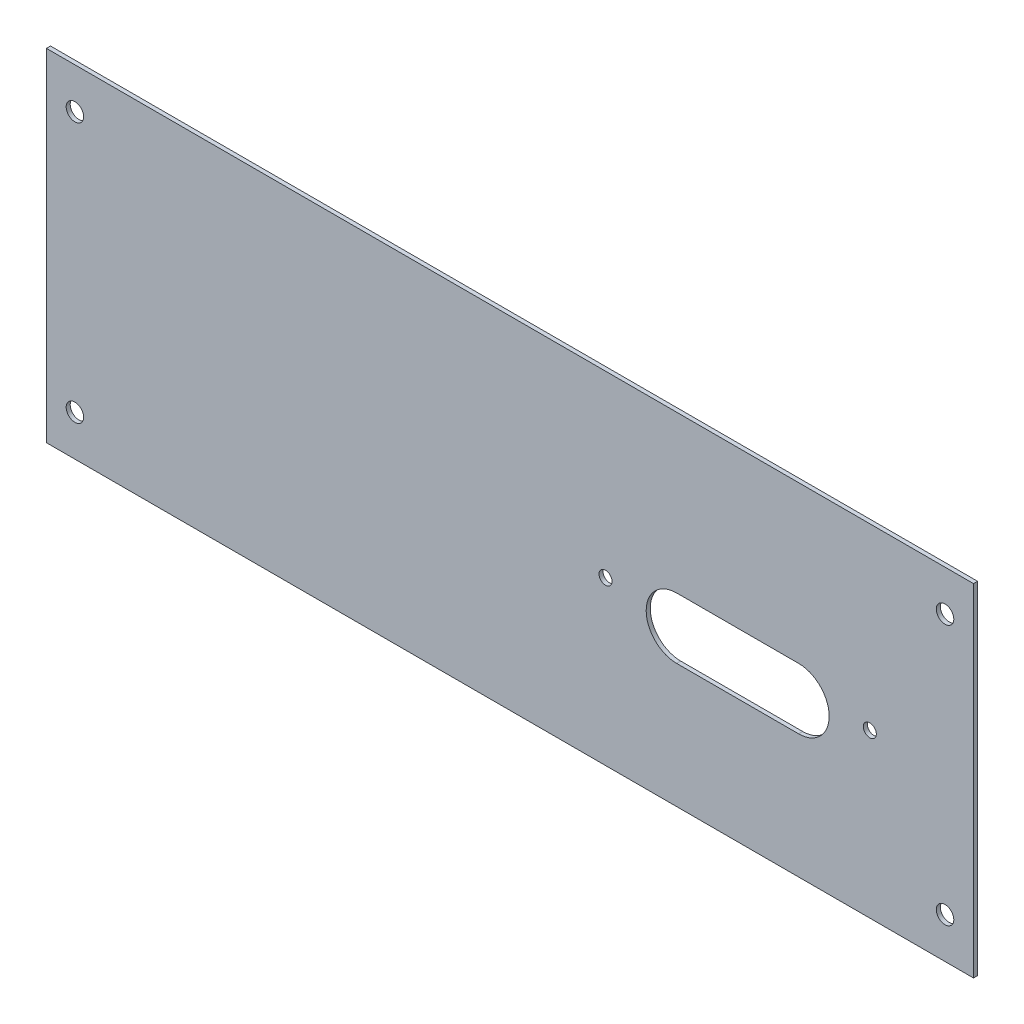
ISO-10303-21;
HEADER;
FILE_DESCRIPTION(('STEP AP214'),'2;1');
FILE_NAME('part.step','',(''),(''),'','','');
FILE_SCHEMA(('AUTOMOTIVE_DESIGN { 1 0 10303 214 1 1 1 1 }'));
ENDSEC;
DATA;
#1=APPLICATION_CONTEXT('core data for automotive mechanical design processes');
#2=APPLICATION_PROTOCOL_DEFINITION('international standard','automotive_design',2000,#1);
#3=PRODUCT_CONTEXT('',#1,'mechanical');
#4=PRODUCT('Part','Part','',(#3));
#5=PRODUCT_RELATED_PRODUCT_CATEGORY('part','',(#4));
#6=PRODUCT_DEFINITION_FORMATION('','',#4);
#7=PRODUCT_DEFINITION_CONTEXT('part definition',#1,'design');
#8=PRODUCT_DEFINITION('design','',#6,#7);
#9=PRODUCT_DEFINITION_SHAPE('','',#8);
#10=(LENGTH_UNIT() NAMED_UNIT(*) SI_UNIT(.MILLI.,.METRE.));
#11=(NAMED_UNIT(*) PLANE_ANGLE_UNIT() SI_UNIT($,.RADIAN.));
#12=(NAMED_UNIT(*) SI_UNIT($,.STERADIAN.) SOLID_ANGLE_UNIT());
#13=UNCERTAINTY_MEASURE_WITH_UNIT(LENGTH_MEASURE(1.E-05),#10,'distance_accuracy_value','');
#14=(GEOMETRIC_REPRESENTATION_CONTEXT(3) GLOBAL_UNCERTAINTY_ASSIGNED_CONTEXT((#13)) GLOBAL_UNIT_ASSIGNED_CONTEXT((#10,
#11,#12)) REPRESENTATION_CONTEXT('',''));
#15=CARTESIAN_POINT('',(0.,0.,0.));
#16=DIRECTION('',(0.,0.,1.));
#17=DIRECTION('',(1.,0.,0.));
#18=AXIS2_PLACEMENT_3D('',#15,#16,#17);
#19=CARTESIAN_POINT('',(-114.,-42.,1.));
#20=DIRECTION('',(0.,0.,-1.));
#21=DIRECTION('',(-1.,0.,0.));
#22=AXIS2_PLACEMENT_3D('',#19,#20,#21);
#23=PLANE('',#22);
#24=CARTESIAN_POINT('',(107.,-32.,1.));
#25=DIRECTION('',(0.,0.,1.));
#26=DIRECTION('',(-1.,0.,0.));
#27=AXIS2_PLACEMENT_3D('',#24,#25,#26);
#28=CIRCLE('',#27,2.15);
#29=CARTESIAN_POINT('',(104.85,-32.,1.));
#30=VERTEX_POINT('',#29);
#31=EDGE_CURVE('E237',#30,#30,#28,.T.);
#32=ORIENTED_EDGE('',*,*,#31,.F.);
#33=EDGE_LOOP('',(#32));
#34=FACE_BOUND('',#33,.T.);
#35=CARTESIAN_POINT('',(-107.,32.,1.));
#36=DIRECTION('',(0.,0.,1.));
#37=DIRECTION('',(-1.,0.,0.));
#38=AXIS2_PLACEMENT_3D('',#35,#36,#37);
#39=CIRCLE('',#38,2.15);
#40=CARTESIAN_POINT('',(-109.15,32.,1.));
#41=VERTEX_POINT('',#40);
#42=EDGE_CURVE('E247',#41,#41,#39,.T.);
#43=ORIENTED_EDGE('',*,*,#42,.F.);
#44=EDGE_LOOP('',(#43));
#45=FACE_BOUND('',#44,.T.);
#46=CARTESIAN_POINT('',(41.,-4.,1.));
#47=DIRECTION('',(0.,0.,1.));
#48=DIRECTION('',(1.,0.,0.));
#49=AXIS2_PLACEMENT_3D('',#46,#47,#48);
#50=CIRCLE('',#49,7.5);
#51=CARTESIAN_POINT('',(41.,3.5,1.));
#52=VERTEX_POINT('',#51);
#53=CARTESIAN_POINT('',(41.,-11.5,1.));
#54=VERTEX_POINT('',#53);
#55=EDGE_CURVE('E98',#52,#54,#50,.T.);
#56=ORIENTED_EDGE('',*,*,#55,.F.);
#57=DIRECTION('',(-1.,0.,0.));
#58=VECTOR('',#57,1.);
#59=CARTESIAN_POINT('',(41.,3.5,1.));
#60=LINE('',#59,#58);
#61=CARTESIAN_POINT('',(71.,3.50000000000002,1.));
#62=VERTEX_POINT('',#61);
#63=EDGE_CURVE('E121',#62,#52,#60,.T.);
#64=ORIENTED_EDGE('',*,*,#63,.F.);
#65=CARTESIAN_POINT('',(71.,-3.99999999999998,1.));
#66=DIRECTION('',(0.,0.,1.));
#67=DIRECTION('',(-1.,0.,0.));
#68=AXIS2_PLACEMENT_3D('',#65,#66,#67);
#69=CIRCLE('',#68,7.5);
#70=CARTESIAN_POINT('',(71.,-11.5,1.));
#71=VERTEX_POINT('',#70);
#72=EDGE_CURVE('E119',#71,#62,#69,.T.);
#73=ORIENTED_EDGE('',*,*,#72,.F.);
#74=DIRECTION('',(1.,0.,0.));
#75=VECTOR('',#74,1.);
#76=CARTESIAN_POINT('',(41.,-11.5,1.));
#77=LINE('',#76,#75);
#78=EDGE_CURVE('E106',#54,#71,#77,.T.);
#79=ORIENTED_EDGE('',*,*,#78,.F.);
#80=EDGE_LOOP('',(#56,#64,#73,#79));
#81=FACE_BOUND('',#80,.T.);
#82=DIRECTION('',(0.,-1.,0.));
#83=VECTOR('',#82,1.);
#84=CARTESIAN_POINT('',(-114.,-42.,1.));
#85=LINE('',#84,#83);
#86=CARTESIAN_POINT('',(-114.,42.,1.));
#87=VERTEX_POINT('',#86);
#88=CARTESIAN_POINT('',(-114.,-42.,1.));
#89=VERTEX_POINT('',#88);
#90=EDGE_CURVE('E143',#87,#89,#85,.T.);
#91=ORIENTED_EDGE('',*,*,#90,.T.);
#92=DIRECTION('',(1.,0.,0.));
#93=VECTOR('',#92,1.);
#94=CARTESIAN_POINT('',(-114.,-42.,1.));
#95=LINE('',#94,#93);
#96=CARTESIAN_POINT('',(114.,-42.,1.));
#97=VERTEX_POINT('',#96);
#98=EDGE_CURVE('E146',#89,#97,#95,.T.);
#99=ORIENTED_EDGE('',*,*,#98,.T.);
#100=DIRECTION('',(0.,1.,0.));
#101=VECTOR('',#100,1.);
#102=CARTESIAN_POINT('',(114.,-42.,1.));
#103=LINE('',#102,#101);
#104=CARTESIAN_POINT('',(114.,42.,1.));
#105=VERTEX_POINT('',#104);
#106=EDGE_CURVE('E149',#97,#105,#103,.T.);
#107=ORIENTED_EDGE('',*,*,#106,.T.);
#108=DIRECTION('',(-1.,0.,0.));
#109=VECTOR('',#108,1.);
#110=CARTESIAN_POINT('',(-114.,42.,1.));
#111=LINE('',#110,#109);
#112=EDGE_CURVE('E151',#105,#87,#111,.T.);
#113=ORIENTED_EDGE('',*,*,#112,.T.);
#114=EDGE_LOOP('',(#91,#99,#107,#113));
#115=FACE_BOUND('',#114,.T.);
#116=CARTESIAN_POINT('',(23.5,-1.99999999999999,1.));
#117=DIRECTION('',(0.,0.,1.));
#118=DIRECTION('',(1.,0.,0.));
#119=AXIS2_PLACEMENT_3D('',#116,#117,#118);
#120=CIRCLE('',#119,1.6);
#121=CARTESIAN_POINT('',(25.1,-1.99999999999999,1.));
#122=VERTEX_POINT('',#121);
#123=EDGE_CURVE('E137',#122,#122,#120,.T.);
#124=ORIENTED_EDGE('',*,*,#123,.F.);
#125=EDGE_LOOP('',(#124));
#126=FACE_BOUND('',#125,.T.);
#127=CARTESIAN_POINT('',(107.,32.,1.));
#128=DIRECTION('',(0.,0.,1.));
#129=DIRECTION('',(1.,0.,0.));
#130=AXIS2_PLACEMENT_3D('',#127,#128,#129);
#131=CIRCLE('',#130,2.15);
#132=CARTESIAN_POINT('',(109.15,32.,1.));
#133=VERTEX_POINT('',#132);
#134=EDGE_CURVE('E127',#133,#133,#131,.T.);
#135=ORIENTED_EDGE('',*,*,#134,.F.);
#136=EDGE_LOOP('',(#135));
#137=FACE_BOUND('',#136,.T.);
#138=CARTESIAN_POINT('',(-107.,-32.,1.));
#139=DIRECTION('',(0.,0.,1.));
#140=DIRECTION('',(1.,0.,0.));
#141=AXIS2_PLACEMENT_3D('',#138,#139,#140);
#142=CIRCLE('',#141,2.15);
#143=CARTESIAN_POINT('',(-104.85,-32.,1.));
#144=VERTEX_POINT('',#143);
#145=EDGE_CURVE('E242',#144,#144,#142,.T.);
#146=ORIENTED_EDGE('',*,*,#145,.F.);
#147=EDGE_LOOP('',(#146));
#148=FACE_BOUND('',#147,.T.);
#149=CARTESIAN_POINT('',(88.5,-1.99999999999999,1.));
#150=DIRECTION('',(0.,0.,1.));
#151=DIRECTION('',(1.,0.,0.));
#152=AXIS2_PLACEMENT_3D('',#149,#150,#151);
#153=CIRCLE('',#152,1.60000000000001);
#154=CARTESIAN_POINT('',(90.1,-1.99999999999999,1.));
#155=VERTEX_POINT('',#154);
#156=EDGE_CURVE('E231',#155,#155,#153,.T.);
#157=ORIENTED_EDGE('',*,*,#156,.F.);
#158=EDGE_LOOP('',(#157));
#159=FACE_BOUND('',#158,.T.);
#160=ADVANCED_FACE('F33',(#34,#45,#81,#115,#126,#137,#148,#159),#23,.F.);
#161=CARTESIAN_POINT('',(-114.,-42.,0.));
#162=DIRECTION('',(0.,0.,-1.));
#163=DIRECTION('',(-1.,0.,0.));
#164=AXIS2_PLACEMENT_3D('',#161,#162,#163);
#165=PLANE('',#164);
#166=CARTESIAN_POINT('',(107.,-32.,0.));
#167=DIRECTION('',(0.,0.,1.));
#168=DIRECTION('',(-1.,0.,0.));
#169=AXIS2_PLACEMENT_3D('',#166,#167,#168);
#170=CIRCLE('',#169,2.15);
#171=CARTESIAN_POINT('',(104.85,-32.,0.));
#172=VERTEX_POINT('',#171);
#173=EDGE_CURVE('E234',#172,#172,#170,.T.);
#174=ORIENTED_EDGE('',*,*,#173,.T.);
#175=EDGE_LOOP('',(#174));
#176=FACE_BOUND('',#175,.T.);
#177=CARTESIAN_POINT('',(-107.,32.,0.));
#178=DIRECTION('',(0.,0.,1.));
#179=DIRECTION('',(-1.,0.,0.));
#180=AXIS2_PLACEMENT_3D('',#177,#178,#179);
#181=CIRCLE('',#180,2.15);
#182=CARTESIAN_POINT('',(-109.15,32.,0.));
#183=VERTEX_POINT('',#182);
#184=EDGE_CURVE('E245',#183,#183,#181,.T.);
#185=ORIENTED_EDGE('',*,*,#184,.T.);
#186=EDGE_LOOP('',(#185));
#187=FACE_BOUND('',#186,.T.);
#188=DIRECTION('',(-1.,0.,0.));
#189=VECTOR('',#188,1.);
#190=CARTESIAN_POINT('',(41.,3.5,0.));
#191=LINE('',#190,#189);
#192=CARTESIAN_POINT('',(71.,3.50000000000002,0.));
#193=VERTEX_POINT('',#192);
#194=CARTESIAN_POINT('',(41.,3.5,0.));
#195=VERTEX_POINT('',#194);
#196=EDGE_CURVE('E107',#193,#195,#191,.T.);
#197=ORIENTED_EDGE('',*,*,#196,.T.);
#198=CARTESIAN_POINT('',(41.,-4.,0.));
#199=DIRECTION('',(0.,0.,1.));
#200=DIRECTION('',(1.,0.,0.));
#201=AXIS2_PLACEMENT_3D('',#198,#199,#200);
#202=CIRCLE('',#201,7.5);
#203=CARTESIAN_POINT('',(41.,-11.5,0.));
#204=VERTEX_POINT('',#203);
#205=EDGE_CURVE('E56',#195,#204,#202,.T.);
#206=ORIENTED_EDGE('',*,*,#205,.T.);
#207=DIRECTION('',(1.,0.,0.));
#208=VECTOR('',#207,1.);
#209=CARTESIAN_POINT('',(41.,-11.5,0.));
#210=LINE('',#209,#208);
#211=CARTESIAN_POINT('',(71.,-11.5,0.));
#212=VERTEX_POINT('',#211);
#213=EDGE_CURVE('E113',#204,#212,#210,.T.);
#214=ORIENTED_EDGE('',*,*,#213,.T.);
#215=CARTESIAN_POINT('',(71.,-3.99999999999998,0.));
#216=DIRECTION('',(0.,0.,1.));
#217=DIRECTION('',(-1.,0.,0.));
#218=AXIS2_PLACEMENT_3D('',#215,#216,#217);
#219=CIRCLE('',#218,7.5);
#220=EDGE_CURVE('E129',#212,#193,#219,.T.);
#221=ORIENTED_EDGE('',*,*,#220,.T.);
#222=EDGE_LOOP('',(#197,#206,#214,#221));
#223=FACE_BOUND('',#222,.T.);
#224=DIRECTION('',(0.,-1.,0.));
#225=VECTOR('',#224,1.);
#226=CARTESIAN_POINT('',(-114.,-42.,0.));
#227=LINE('',#226,#225);
#228=CARTESIAN_POINT('',(-114.,42.,0.));
#229=VERTEX_POINT('',#228);
#230=CARTESIAN_POINT('',(-114.,-42.,0.));
#231=VERTEX_POINT('',#230);
#232=EDGE_CURVE('E140',#229,#231,#227,.T.);
#233=ORIENTED_EDGE('',*,*,#232,.F.);
#234=DIRECTION('',(-1.,0.,0.));
#235=VECTOR('',#234,1.);
#236=CARTESIAN_POINT('',(-114.,42.,0.));
#237=LINE('',#236,#235);
#238=CARTESIAN_POINT('',(114.,42.,0.));
#239=VERTEX_POINT('',#238);
#240=EDGE_CURVE('E147',#239,#229,#237,.T.);
#241=ORIENTED_EDGE('',*,*,#240,.F.);
#242=DIRECTION('',(0.,1.,0.));
#243=VECTOR('',#242,1.);
#244=CARTESIAN_POINT('',(114.,-42.,0.));
#245=LINE('',#244,#243);
#246=CARTESIAN_POINT('',(114.,-42.,0.));
#247=VERTEX_POINT('',#246);
#248=EDGE_CURVE('E158',#247,#239,#245,.T.);
#249=ORIENTED_EDGE('',*,*,#248,.F.);
#250=DIRECTION('',(1.,0.,0.));
#251=VECTOR('',#250,1.);
#252=CARTESIAN_POINT('',(-114.,-42.,0.));
#253=LINE('',#252,#251);
#254=EDGE_CURVE('E156',#231,#247,#253,.T.);
#255=ORIENTED_EDGE('',*,*,#254,.F.);
#256=EDGE_LOOP('',(#233,#241,#249,#255));
#257=FACE_BOUND('',#256,.T.);
#258=CARTESIAN_POINT('',(23.5,-1.99999999999999,0.));
#259=DIRECTION('',(0.,0.,1.));
#260=DIRECTION('',(1.,0.,0.));
#261=AXIS2_PLACEMENT_3D('',#258,#259,#260);
#262=CIRCLE('',#261,1.6);
#263=CARTESIAN_POINT('',(25.1,-1.99999999999999,0.));
#264=VERTEX_POINT('',#263);
#265=EDGE_CURVE('E114',#264,#264,#262,.T.);
#266=ORIENTED_EDGE('',*,*,#265,.T.);
#267=EDGE_LOOP('',(#266));
#268=FACE_BOUND('',#267,.T.);
#269=CARTESIAN_POINT('',(107.,32.,0.));
#270=DIRECTION('',(0.,0.,1.));
#271=DIRECTION('',(1.,0.,0.));
#272=AXIS2_PLACEMENT_3D('',#269,#270,#271);
#273=CIRCLE('',#272,2.15);
#274=CARTESIAN_POINT('',(109.15,32.,0.));
#275=VERTEX_POINT('',#274);
#276=EDGE_CURVE('E222',#275,#275,#273,.T.);
#277=ORIENTED_EDGE('',*,*,#276,.T.);
#278=EDGE_LOOP('',(#277));
#279=FACE_BOUND('',#278,.T.);
#280=CARTESIAN_POINT('',(-107.,-32.,0.));
#281=DIRECTION('',(0.,0.,1.));
#282=DIRECTION('',(1.,0.,0.));
#283=AXIS2_PLACEMENT_3D('',#280,#281,#282);
#284=CIRCLE('',#283,2.15);
#285=CARTESIAN_POINT('',(-104.85,-32.,0.));
#286=VERTEX_POINT('',#285);
#287=EDGE_CURVE('E226',#286,#286,#284,.T.);
#288=ORIENTED_EDGE('',*,*,#287,.T.);
#289=EDGE_LOOP('',(#288));
#290=FACE_BOUND('',#289,.T.);
#291=CARTESIAN_POINT('',(88.5,-1.99999999999999,0.));
#292=DIRECTION('',(0.,0.,1.));
#293=DIRECTION('',(1.,0.,0.));
#294=AXIS2_PLACEMENT_3D('',#291,#292,#293);
#295=CIRCLE('',#294,1.60000000000001);
#296=CARTESIAN_POINT('',(90.1,-1.99999999999999,0.));
#297=VERTEX_POINT('',#296);
#298=EDGE_CURVE('E229',#297,#297,#295,.T.);
#299=ORIENTED_EDGE('',*,*,#298,.T.);
#300=EDGE_LOOP('',(#299));
#301=FACE_BOUND('',#300,.T.);
#302=ADVANCED_FACE('F176',(#176,#187,#223,#257,#268,#279,#290,#301),#165,.T.);
#303=CARTESIAN_POINT('',(-114.,-42.,1.));
#304=DIRECTION('',(1.,0.,0.));
#305=DIRECTION('',(0.,0.,-1.));
#306=AXIS2_PLACEMENT_3D('',#303,#304,#305);
#307=PLANE('',#306);
#308=ORIENTED_EDGE('',*,*,#232,.T.);
#309=DIRECTION('',(0.,0.,-1.));
#310=VECTOR('',#309,1.);
#311=CARTESIAN_POINT('',(-114.,-42.,1.));
#312=LINE('',#311,#310);
#313=EDGE_CURVE('E11',#89,#231,#312,.T.);
#314=ORIENTED_EDGE('',*,*,#313,.F.);
#315=ORIENTED_EDGE('',*,*,#90,.F.);
#316=DIRECTION('',(0.,0.,-1.));
#317=VECTOR('',#316,1.);
#318=CARTESIAN_POINT('',(-114.,42.,1.));
#319=LINE('',#318,#317);
#320=EDGE_CURVE('E153',#87,#229,#319,.T.);
#321=ORIENTED_EDGE('',*,*,#320,.T.);
#322=EDGE_LOOP('',(#308,#314,#315,#321));
#323=FACE_BOUND('',#322,.T.);
#324=ADVANCED_FACE('F35',(#323),#307,.F.);
#325=CARTESIAN_POINT('',(-114.,-42.,1.));
#326=DIRECTION('',(0.,1.,0.));
#327=DIRECTION('',(0.,0.,1.));
#328=AXIS2_PLACEMENT_3D('',#325,#326,#327);
#329=PLANE('',#328);
#330=ORIENTED_EDGE('',*,*,#254,.T.);
#331=DIRECTION('',(0.,0.,-1.));
#332=VECTOR('',#331,1.);
#333=CARTESIAN_POINT('',(114.,-42.,1.));
#334=LINE('',#333,#332);
#335=EDGE_CURVE('E41',#97,#247,#334,.T.);
#336=ORIENTED_EDGE('',*,*,#335,.F.);
#337=ORIENTED_EDGE('',*,*,#98,.F.);
#338=ORIENTED_EDGE('',*,*,#313,.T.);
#339=EDGE_LOOP('',(#330,#336,#337,#338));
#340=FACE_BOUND('',#339,.T.);
#341=ADVANCED_FACE('F186',(#340),#329,.F.);
#342=CARTESIAN_POINT('',(114.,-42.,1.));
#343=DIRECTION('',(-1.,0.,0.));
#344=DIRECTION('',(0.,0.,1.));
#345=AXIS2_PLACEMENT_3D('',#342,#343,#344);
#346=PLANE('',#345);
#347=ORIENTED_EDGE('',*,*,#248,.T.);
#348=DIRECTION('',(0.,0.,-1.));
#349=VECTOR('',#348,1.);
#350=CARTESIAN_POINT('',(114.,42.,1.));
#351=LINE('',#350,#349);
#352=EDGE_CURVE('E163',#105,#239,#351,.T.);
#353=ORIENTED_EDGE('',*,*,#352,.F.);
#354=ORIENTED_EDGE('',*,*,#106,.F.);
#355=ORIENTED_EDGE('',*,*,#335,.T.);
#356=EDGE_LOOP('',(#347,#353,#354,#355));
#357=FACE_BOUND('',#356,.T.);
#358=ADVANCED_FACE('F170',(#357),#346,.F.);
#359=CARTESIAN_POINT('',(-114.,42.,1.));
#360=DIRECTION('',(0.,-1.,0.));
#361=DIRECTION('',(1.,0.,0.));
#362=AXIS2_PLACEMENT_3D('',#359,#360,#361);
#363=PLANE('',#362);
#364=ORIENTED_EDGE('',*,*,#240,.T.);
#365=ORIENTED_EDGE('',*,*,#320,.F.);
#366=ORIENTED_EDGE('',*,*,#112,.F.);
#367=ORIENTED_EDGE('',*,*,#352,.T.);
#368=EDGE_LOOP('',(#364,#365,#366,#367));
#369=FACE_BOUND('',#368,.T.);
#370=ADVANCED_FACE('F180',(#369),#363,.F.);
#371=CARTESIAN_POINT('',(23.5,-1.99999999999999,1.));
#372=DIRECTION('',(0.,0.,-1.));
#373=DIRECTION('',(-1.,0.,0.));
#374=AXIS2_PLACEMENT_3D('',#371,#372,#373);
#375=CYLINDRICAL_SURFACE('',#374,1.6);
#376=ORIENTED_EDGE('',*,*,#123,.T.);
#377=EDGE_LOOP('',(#376));
#378=FACE_BOUND('',#377,.T.);
#379=ORIENTED_EDGE('',*,*,#265,.F.);
#380=EDGE_LOOP('',(#379));
#381=FACE_BOUND('',#380,.T.);
#382=ADVANCED_FACE('F204',(#378,#381),#375,.F.);
#383=CARTESIAN_POINT('',(41.,-4.,1.));
#384=DIRECTION('',(0.,0.,-1.));
#385=DIRECTION('',(-1.,0.,0.));
#386=AXIS2_PLACEMENT_3D('',#383,#384,#385);
#387=CYLINDRICAL_SURFACE('',#386,7.5);
#388=ORIENTED_EDGE('',*,*,#205,.F.);
#389=DIRECTION('',(0.,0.,-1.));
#390=VECTOR('',#389,1.);
#391=CARTESIAN_POINT('',(41.,3.5,1.));
#392=LINE('',#391,#390);
#393=EDGE_CURVE('E102',#52,#195,#392,.T.);
#394=ORIENTED_EDGE('',*,*,#393,.F.);
#395=ORIENTED_EDGE('',*,*,#55,.T.);
#396=DIRECTION('',(0.,0.,-1.));
#397=VECTOR('',#396,1.);
#398=CARTESIAN_POINT('',(41.,-11.5,1.));
#399=LINE('',#398,#397);
#400=EDGE_CURVE('E101',#54,#204,#399,.T.);
#401=ORIENTED_EDGE('',*,*,#400,.T.);
#402=EDGE_LOOP('',(#388,#394,#395,#401));
#403=FACE_BOUND('',#402,.T.);
#404=ADVANCED_FACE('F100',(#403),#387,.F.);
#405=CARTESIAN_POINT('',(41.,-11.5,1.));
#406=DIRECTION('',(0.,1.,0.));
#407=DIRECTION('',(-1.,0.,0.));
#408=AXIS2_PLACEMENT_3D('',#405,#406,#407);
#409=PLANE('',#408);
#410=ORIENTED_EDGE('',*,*,#213,.F.);
#411=ORIENTED_EDGE('',*,*,#400,.F.);
#412=ORIENTED_EDGE('',*,*,#78,.T.);
#413=DIRECTION('',(0.,0.,-1.));
#414=VECTOR('',#413,1.);
#415=CARTESIAN_POINT('',(71.,-11.5,1.));
#416=LINE('',#415,#414);
#417=EDGE_CURVE('E115',#71,#212,#416,.T.);
#418=ORIENTED_EDGE('',*,*,#417,.T.);
#419=EDGE_LOOP('',(#410,#411,#412,#418));
#420=FACE_BOUND('',#419,.T.);
#421=ADVANCED_FACE('F110',(#420),#409,.T.);
#422=CARTESIAN_POINT('',(71.,-3.99999999999998,1.));
#423=DIRECTION('',(0.,0.,-1.));
#424=DIRECTION('',(-1.,0.,0.));
#425=AXIS2_PLACEMENT_3D('',#422,#423,#424);
#426=CYLINDRICAL_SURFACE('',#425,7.5);
#427=ORIENTED_EDGE('',*,*,#220,.F.);
#428=ORIENTED_EDGE('',*,*,#417,.F.);
#429=ORIENTED_EDGE('',*,*,#72,.T.);
#430=DIRECTION('',(0.,0.,-1.));
#431=VECTOR('',#430,1.);
#432=CARTESIAN_POINT('',(71.,3.50000000000002,1.));
#433=LINE('',#432,#431);
#434=EDGE_CURVE('E48',#62,#193,#433,.T.);
#435=ORIENTED_EDGE('',*,*,#434,.T.);
#436=EDGE_LOOP('',(#427,#428,#429,#435));
#437=FACE_BOUND('',#436,.T.);
#438=ADVANCED_FACE('F286',(#437),#426,.F.);
#439=CARTESIAN_POINT('',(41.,3.5,1.));
#440=DIRECTION('',(0.,-1.,0.));
#441=DIRECTION('',(1.,0.,0.));
#442=AXIS2_PLACEMENT_3D('',#439,#440,#441);
#443=PLANE('',#442);
#444=ORIENTED_EDGE('',*,*,#196,.F.);
#445=ORIENTED_EDGE('',*,*,#434,.F.);
#446=ORIENTED_EDGE('',*,*,#63,.T.);
#447=ORIENTED_EDGE('',*,*,#393,.T.);
#448=EDGE_LOOP('',(#444,#445,#446,#447));
#449=FACE_BOUND('',#448,.T.);
#450=ADVANCED_FACE('F283',(#449),#443,.T.);
#451=CARTESIAN_POINT('',(107.,32.,1.));
#452=DIRECTION('',(0.,0.,-1.));
#453=DIRECTION('',(-1.,0.,0.));
#454=AXIS2_PLACEMENT_3D('',#451,#452,#453);
#455=CYLINDRICAL_SURFACE('',#454,2.15);
#456=ORIENTED_EDGE('',*,*,#134,.T.);
#457=EDGE_LOOP('',(#456));
#458=FACE_BOUND('',#457,.T.);
#459=ORIENTED_EDGE('',*,*,#276,.F.);
#460=EDGE_LOOP('',(#459));
#461=FACE_BOUND('',#460,.T.);
#462=ADVANCED_FACE('F255',(#458,#461),#455,.F.);
#463=CARTESIAN_POINT('',(-107.,32.,1.));
#464=DIRECTION('',(0.,0.,-1.));
#465=DIRECTION('',(-1.,0.,0.));
#466=AXIS2_PLACEMENT_3D('',#463,#464,#465);
#467=CYLINDRICAL_SURFACE('',#466,2.15);
#468=ORIENTED_EDGE('',*,*,#42,.T.);
#469=EDGE_LOOP('',(#468));
#470=FACE_BOUND('',#469,.T.);
#471=ORIENTED_EDGE('',*,*,#184,.F.);
#472=EDGE_LOOP('',(#471));
#473=FACE_BOUND('',#472,.T.);
#474=ADVANCED_FACE('F276',(#470,#473),#467,.F.);
#475=CARTESIAN_POINT('',(-107.,-32.,1.));
#476=DIRECTION('',(0.,0.,-1.));
#477=DIRECTION('',(-1.,0.,0.));
#478=AXIS2_PLACEMENT_3D('',#475,#476,#477);
#479=CYLINDRICAL_SURFACE('',#478,2.15);
#480=ORIENTED_EDGE('',*,*,#145,.T.);
#481=EDGE_LOOP('',(#480));
#482=FACE_BOUND('',#481,.T.);
#483=ORIENTED_EDGE('',*,*,#287,.F.);
#484=EDGE_LOOP('',(#483));
#485=FACE_BOUND('',#484,.T.);
#486=ADVANCED_FACE('F270',(#482,#485),#479,.F.);
#487=CARTESIAN_POINT('',(107.,-32.,1.));
#488=DIRECTION('',(0.,0.,-1.));
#489=DIRECTION('',(-1.,0.,0.));
#490=AXIS2_PLACEMENT_3D('',#487,#488,#489);
#491=CYLINDRICAL_SURFACE('',#490,2.15);
#492=ORIENTED_EDGE('',*,*,#31,.T.);
#493=EDGE_LOOP('',(#492));
#494=FACE_BOUND('',#493,.T.);
#495=ORIENTED_EDGE('',*,*,#173,.F.);
#496=EDGE_LOOP('',(#495));
#497=FACE_BOUND('',#496,.T.);
#498=ADVANCED_FACE('F265',(#494,#497),#491,.F.);
#499=CARTESIAN_POINT('',(88.5,-1.99999999999999,1.));
#500=DIRECTION('',(0.,0.,-1.));
#501=DIRECTION('',(-1.,0.,0.));
#502=AXIS2_PLACEMENT_3D('',#499,#500,#501);
#503=CYLINDRICAL_SURFACE('',#502,1.60000000000001);
#504=ORIENTED_EDGE('',*,*,#156,.T.);
#505=EDGE_LOOP('',(#504));
#506=FACE_BOUND('',#505,.T.);
#507=ORIENTED_EDGE('',*,*,#298,.F.);
#508=EDGE_LOOP('',(#507));
#509=FACE_BOUND('',#508,.T.);
#510=ADVANCED_FACE('F263',(#506,#509),#503,.F.);
#511=CLOSED_SHELL('',(#160,#302,#324,#341,#358,#370,#382,#404,#421,#438,#450,#462,#474,#486,
#498,#510));
#512=MANIFOLD_SOLID_BREP('B2',#511);
#513=ADVANCED_BREP_SHAPE_REPRESENTATION('',(#18,#512),#14);
#514=SHAPE_DEFINITION_REPRESENTATION(#9,#513);
ENDSEC;
END-ISO-10303-21;
